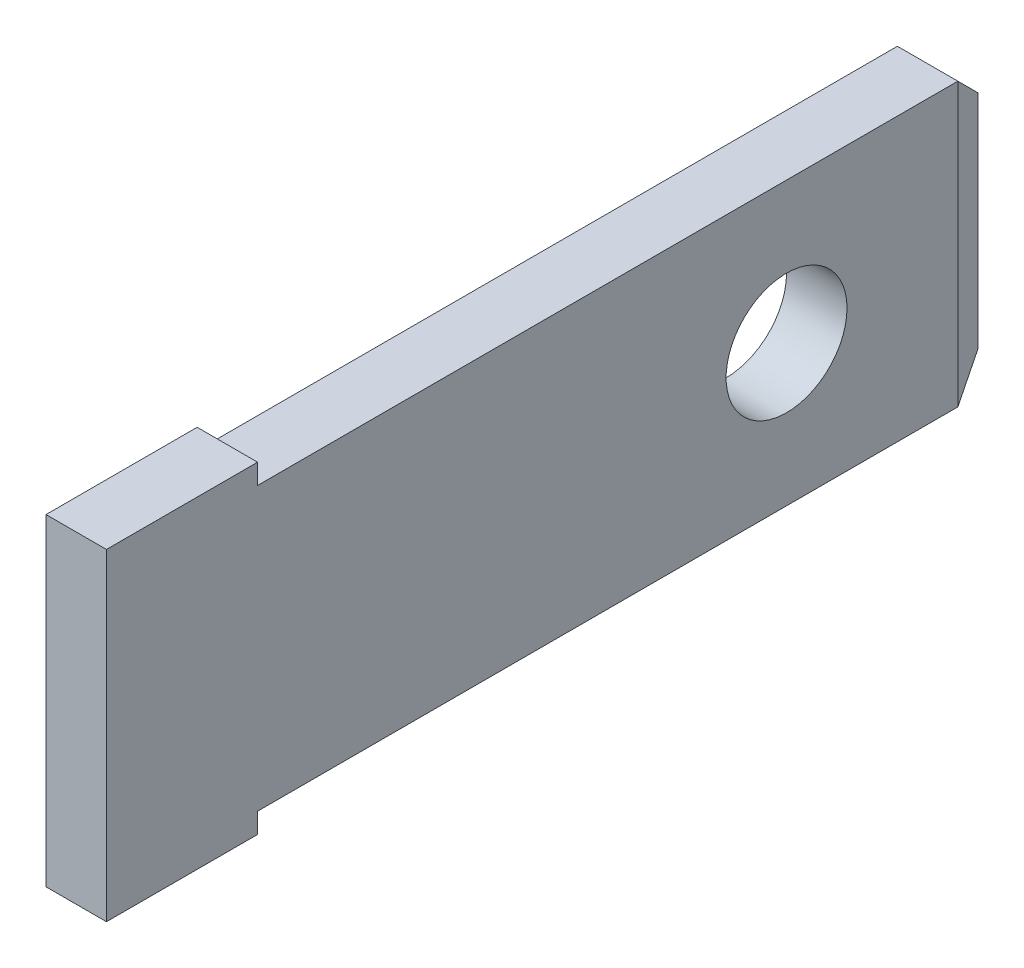
ISO-10303-21;
HEADER;
FILE_DESCRIPTION(('STEP AP214'),'2;1');
FILE_NAME('part.step','',(''),(''),'','','');
FILE_SCHEMA(('AUTOMOTIVE_DESIGN { 1 0 10303 214 1 1 1 1 }'));
ENDSEC;
DATA;
#1=APPLICATION_CONTEXT('core data for automotive mechanical design processes');
#2=APPLICATION_PROTOCOL_DEFINITION('international standard','automotive_design',2000,#1);
#3=PRODUCT_CONTEXT('',#1,'mechanical');
#4=PRODUCT('Part','Part','',(#3));
#5=PRODUCT_RELATED_PRODUCT_CATEGORY('part','',(#4));
#6=PRODUCT_DEFINITION_FORMATION('','',#4);
#7=PRODUCT_DEFINITION_CONTEXT('part definition',#1,'design');
#8=PRODUCT_DEFINITION('design','',#6,#7);
#9=PRODUCT_DEFINITION_SHAPE('','',#8);
#10=(LENGTH_UNIT() NAMED_UNIT(*) SI_UNIT(.MILLI.,.METRE.));
#11=(NAMED_UNIT(*) PLANE_ANGLE_UNIT() SI_UNIT($,.RADIAN.));
#12=(NAMED_UNIT(*) SI_UNIT($,.STERADIAN.) SOLID_ANGLE_UNIT());
#13=UNCERTAINTY_MEASURE_WITH_UNIT(LENGTH_MEASURE(1.E-05),#10,'distance_accuracy_value','');
#14=(GEOMETRIC_REPRESENTATION_CONTEXT(3) GLOBAL_UNCERTAINTY_ASSIGNED_CONTEXT((#13)) GLOBAL_UNIT_ASSIGNED_CONTEXT((#10,
#11,#12)) REPRESENTATION_CONTEXT('',''));
#15=CARTESIAN_POINT('',(0.,0.,0.));
#16=DIRECTION('',(0.,0.,1.));
#17=DIRECTION('',(1.,0.,0.));
#18=AXIS2_PLACEMENT_3D('',#15,#16,#17);
#19=CARTESIAN_POINT('',(0.25,1.35,-8.1));
#20=DIRECTION('',(0.948683298050514,0.,-0.316227766016836));
#21=DIRECTION('',(-0.316227766016836,0.,-0.948683298050514));
#22=AXIS2_PLACEMENT_3D('',#19,#20,#21);
#23=PLANE('',#22);
#24=DIRECTION('',(-0.229415733870561,-0.688247201611685,-0.688247201611686));
#25=VECTOR('',#24,1.);
#26=CARTESIAN_POINT('',(0.3,1.4,-7.95));
#27=LINE('',#26,#25);
#28=CARTESIAN_POINT('',(0.3,1.4,-7.95));
#29=VERTEX_POINT('',#28);
#30=CARTESIAN_POINT('',(0.2,1.1,-8.25));
#31=VERTEX_POINT('',#30);
#32=EDGE_CURVE('E108',#29,#31,#27,.T.);
#33=ORIENTED_EDGE('',*,*,#32,.F.);
#34=DIRECTION('',(0.,1.,0.));
#35=VECTOR('',#34,1.);
#36=CARTESIAN_POINT('',(0.299999999999999,1.6,-7.95));
#37=LINE('',#36,#35);
#38=CARTESIAN_POINT('',(0.3,-1.4,-7.95));
#39=VERTEX_POINT('',#38);
#40=EDGE_CURVE('E104',#39,#29,#37,.T.);
#41=ORIENTED_EDGE('',*,*,#40,.F.);
#42=DIRECTION('',(0.229415733870562,-0.688247201611685,0.688247201611686));
#43=VECTOR('',#42,1.);
#44=CARTESIAN_POINT('',(0.2,-1.1,-8.25));
#45=LINE('',#44,#43);
#46=CARTESIAN_POINT('',(0.2,-1.1,-8.25));
#47=VERTEX_POINT('',#46);
#48=EDGE_CURVE('E102',#47,#39,#45,.T.);
#49=ORIENTED_EDGE('',*,*,#48,.F.);
#50=DIRECTION('',(0.,1.,0.));
#51=VECTOR('',#50,1.);
#52=CARTESIAN_POINT('',(0.2,1.1,-8.25));
#53=LINE('',#52,#51);
#54=EDGE_CURVE('E90',#31,#47,#53,.F.);
#55=ORIENTED_EDGE('',*,*,#54,.F.);
#56=EDGE_LOOP('',(#33,#41,#49,#55));
#57=FACE_BOUND('',#56,.T.);
#58=ADVANCED_FACE('F16',(#57),#23,.T.);
#59=CARTESIAN_POINT('',(0.,1.1,-8.25));
#60=DIRECTION('',(0.,0.,-1.));
#61=DIRECTION('',(-1.,0.,0.));
#62=AXIS2_PLACEMENT_3D('',#59,#60,#61);
#63=PLANE('',#62);
#64=ORIENTED_EDGE('',*,*,#54,.T.);
#65=DIRECTION('',(1.,0.,0.));
#66=VECTOR('',#65,1.);
#67=CARTESIAN_POINT('',(0.,-1.1,-8.25));
#68=LINE('',#67,#66);
#69=CARTESIAN_POINT('',(-0.2,-1.1,-8.25));
#70=VERTEX_POINT('',#69);
#71=EDGE_CURVE('E96',#70,#47,#68,.T.);
#72=ORIENTED_EDGE('',*,*,#71,.F.);
#73=DIRECTION('',(0.,1.,0.));
#74=VECTOR('',#73,1.);
#75=CARTESIAN_POINT('',(-0.199999999999999,-0.250000000000002,-8.25));
#76=LINE('',#75,#74);
#77=CARTESIAN_POINT('',(-0.2,1.1,-8.25));
#78=VERTEX_POINT('',#77);
#79=EDGE_CURVE('E122',#78,#70,#76,.F.);
#80=ORIENTED_EDGE('',*,*,#79,.F.);
#81=DIRECTION('',(1.,0.,0.));
#82=VECTOR('',#81,1.);
#83=CARTESIAN_POINT('',(0.,1.1,-8.25));
#84=LINE('',#83,#82);
#85=EDGE_CURVE('E98',#31,#78,#84,.F.);
#86=ORIENTED_EDGE('',*,*,#85,.F.);
#87=EDGE_LOOP('',(#64,#72,#80,#86));
#88=FACE_BOUND('',#87,.T.);
#89=ADVANCED_FACE('F93',(#88),#63,.T.);
#90=CARTESIAN_POINT('',(0.,-1.1,-8.25));
#91=DIRECTION('',(0.,-0.707106781186548,-0.707106781186547));
#92=DIRECTION('',(0.,0.707106781186547,-0.707106781186548));
#93=AXIS2_PLACEMENT_3D('',#90,#91,#92);
#94=PLANE('',#93);
#95=ORIENTED_EDGE('',*,*,#48,.T.);
#96=DIRECTION('',(1.,0.,0.));
#97=VECTOR('',#96,1.);
#98=CARTESIAN_POINT('',(0.,-1.4,-7.95));
#99=LINE('',#98,#97);
#100=CARTESIAN_POINT('',(-0.3,-1.4,-7.95));
#101=VERTEX_POINT('',#100);
#102=EDGE_CURVE('E127',#101,#39,#99,.T.);
#103=ORIENTED_EDGE('',*,*,#102,.F.);
#104=DIRECTION('',(-0.229415733870563,-0.688247201611685,0.688247201611685));
#105=VECTOR('',#104,1.);
#106=CARTESIAN_POINT('',(-0.2,-1.1,-8.25));
#107=LINE('',#106,#105);
#108=EDGE_CURVE('E112',#70,#101,#107,.T.);
#109=ORIENTED_EDGE('',*,*,#108,.F.);
#110=ORIENTED_EDGE('',*,*,#71,.T.);
#111=EDGE_LOOP('',(#95,#103,#109,#110));
#112=FACE_BOUND('',#111,.T.);
#113=ADVANCED_FACE('F110',(#112),#94,.T.);
#114=CARTESIAN_POINT('',(0.,1.4,-7.95));
#115=DIRECTION('',(0.,0.707106781186548,-0.707106781186547));
#116=DIRECTION('',(0.,0.707106781186547,0.707106781186548));
#117=AXIS2_PLACEMENT_3D('',#114,#115,#116);
#118=PLANE('',#117);
#119=ORIENTED_EDGE('',*,*,#32,.T.);
#120=ORIENTED_EDGE('',*,*,#85,.T.);
#121=DIRECTION('',(0.229415733870564,-0.688247201611683,-0.688247201611687));
#122=VECTOR('',#121,1.);
#123=CARTESIAN_POINT('',(-0.300000000000001,1.4,-7.95));
#124=LINE('',#123,#122);
#125=CARTESIAN_POINT('',(-0.3,1.4,-7.95));
#126=VERTEX_POINT('',#125);
#127=EDGE_CURVE('E119',#126,#78,#124,.T.);
#128=ORIENTED_EDGE('',*,*,#127,.F.);
#129=DIRECTION('',(1.,0.,0.));
#130=VECTOR('',#129,1.);
#131=CARTESIAN_POINT('',(0.,1.4,-7.95));
#132=LINE('',#131,#130);
#133=EDGE_CURVE('E158',#29,#126,#132,.F.);
#134=ORIENTED_EDGE('',*,*,#133,.F.);
#135=EDGE_LOOP('',(#119,#120,#128,#134));
#136=FACE_BOUND('',#135,.T.);
#137=ADVANCED_FACE('F191',(#136),#118,.T.);
#138=CARTESIAN_POINT('',(0.299999999999999,1.6,0.));
#139=DIRECTION('',(1.,0.,0.));
#140=DIRECTION('',(0.,0.,-1.));
#141=AXIS2_PLACEMENT_3D('',#138,#139,#140);
#142=PLANE('',#141);
#143=CARTESIAN_POINT('',(0.3,0.,-6.25));
#144=DIRECTION('',(1.,0.,0.));
#145=DIRECTION('',(0.,0.,-1.));
#146=AXIS2_PLACEMENT_3D('',#143,#144,#145);
#147=CIRCLE('',#146,0.6);
#148=CARTESIAN_POINT('',(0.3,0.,-6.85));
#149=VERTEX_POINT('',#148);
#150=EDGE_CURVE('E19',#149,#149,#147,.F.);
#151=ORIENTED_EDGE('',*,*,#150,.T.);
#152=EDGE_LOOP('',(#151));
#153=FACE_BOUND('',#152,.T.);
#154=DIRECTION('',(0.,1.,0.));
#155=VECTOR('',#154,1.);
#156=CARTESIAN_POINT('',(0.3,1.6,-1.));
#157=LINE('',#156,#155);
#158=CARTESIAN_POINT('',(0.3,-1.4,-1.));
#159=VERTEX_POINT('',#158);
#160=CARTESIAN_POINT('',(0.3,-1.6,-1.));
#161=VERTEX_POINT('',#160);
#162=EDGE_CURVE('E132',#159,#161,#157,.F.);
#163=ORIENTED_EDGE('',*,*,#162,.F.);
#164=DIRECTION('',(0.,0.,-1.));
#165=VECTOR('',#164,1.);
#166=CARTESIAN_POINT('',(0.3,-1.4,-7.95));
#167=LINE('',#166,#165);
#168=EDGE_CURVE('E125',#39,#159,#167,.F.);
#169=ORIENTED_EDGE('',*,*,#168,.F.);
#170=ORIENTED_EDGE('',*,*,#40,.T.);
#171=DIRECTION('',(0.,0.,1.));
#172=VECTOR('',#171,1.);
#173=CARTESIAN_POINT('',(0.3,1.4,-1.));
#174=LINE('',#173,#172);
#175=CARTESIAN_POINT('',(0.299999999999999,1.4,-1.));
#176=VERTEX_POINT('',#175);
#177=EDGE_CURVE('E155',#176,#29,#174,.F.);
#178=ORIENTED_EDGE('',*,*,#177,.F.);
#179=DIRECTION('',(0.,1.,0.));
#180=VECTOR('',#179,1.);
#181=CARTESIAN_POINT('',(0.3,1.6,-1.));
#182=LINE('',#181,#180);
#183=CARTESIAN_POINT('',(0.299999999999999,1.6,-1.));
#184=VERTEX_POINT('',#183);
#185=EDGE_CURVE('E153',#184,#176,#182,.F.);
#186=ORIENTED_EDGE('',*,*,#185,.F.);
#187=DIRECTION('',(0.,0.,1.));
#188=VECTOR('',#187,1.);
#189=CARTESIAN_POINT('',(0.299999999999999,1.6,0.));
#190=LINE('',#189,#188);
#191=CARTESIAN_POINT('',(0.299999999999999,1.6,0.5));
#192=VERTEX_POINT('',#191);
#193=EDGE_CURVE('E148',#192,#184,#190,.F.);
#194=ORIENTED_EDGE('',*,*,#193,.F.);
#195=DIRECTION('',(0.,1.,0.));
#196=VECTOR('',#195,1.);
#197=CARTESIAN_POINT('',(0.3,0.,0.5));
#198=LINE('',#197,#196);
#199=CARTESIAN_POINT('',(0.299999999999999,-1.6,0.5));
#200=VERTEX_POINT('',#199);
#201=EDGE_CURVE('E140',#200,#192,#198,.T.);
#202=ORIENTED_EDGE('',*,*,#201,.F.);
#203=DIRECTION('',(0.,0.,-1.));
#204=VECTOR('',#203,1.);
#205=CARTESIAN_POINT('',(0.3,-1.6,0.));
#206=LINE('',#205,#204);
#207=EDGE_CURVE('E137',#161,#200,#206,.F.);
#208=ORIENTED_EDGE('',*,*,#207,.F.);
#209=EDGE_LOOP('',(#163,#169,#170,#178,#186,#194,#202,#208));
#210=FACE_BOUND('',#209,.T.);
#211=ADVANCED_FACE('F239',(#153,#210),#142,.T.);
#212=CARTESIAN_POINT('',(-0.25,-0.250000000000002,-8.1));
#213=DIRECTION('',(-0.948683298050513,0.,-0.31622776601684));
#214=DIRECTION('',(-0.31622776601684,0.,0.948683298050513));
#215=AXIS2_PLACEMENT_3D('',#212,#213,#214);
#216=PLANE('',#215);
#217=ORIENTED_EDGE('',*,*,#108,.T.);
#218=DIRECTION('',(0.,1.,0.));
#219=VECTOR('',#218,1.);
#220=CARTESIAN_POINT('',(-0.3,-1.6,-7.95));
#221=LINE('',#220,#219);
#222=EDGE_CURVE('E162',#126,#101,#221,.F.);
#223=ORIENTED_EDGE('',*,*,#222,.F.);
#224=ORIENTED_EDGE('',*,*,#127,.T.);
#225=ORIENTED_EDGE('',*,*,#79,.T.);
#226=EDGE_LOOP('',(#217,#223,#224,#225));
#227=FACE_BOUND('',#226,.T.);
#228=ADVANCED_FACE('F193',(#227),#216,.T.);
#229=CARTESIAN_POINT('',(0.,-1.4,-7.95));
#230=DIRECTION('',(0.,-1.,0.));
#231=DIRECTION('',(0.,0.,-1.));
#232=AXIS2_PLACEMENT_3D('',#229,#230,#231);
#233=PLANE('',#232);
#234=DIRECTION('',(0.,0.,1.));
#235=VECTOR('',#234,1.);
#236=CARTESIAN_POINT('',(-0.3,-1.4,0.));
#237=LINE('',#236,#235);
#238=CARTESIAN_POINT('',(-0.3,-1.4,-1.));
#239=VERTEX_POINT('',#238);
#240=EDGE_CURVE('E165',#101,#239,#237,.T.);
#241=ORIENTED_EDGE('',*,*,#240,.F.);
#242=ORIENTED_EDGE('',*,*,#102,.T.);
#243=ORIENTED_EDGE('',*,*,#168,.T.);
#244=DIRECTION('',(-1.,0.,0.));
#245=VECTOR('',#244,1.);
#246=CARTESIAN_POINT('',(0.,-1.4,-1.));
#247=LINE('',#246,#245);
#248=EDGE_CURVE('E129',#239,#159,#247,.F.);
#249=ORIENTED_EDGE('',*,*,#248,.F.);
#250=EDGE_LOOP('',(#241,#242,#243,#249));
#251=FACE_BOUND('',#250,.T.);
#252=ADVANCED_FACE('F196',(#251),#233,.T.);
#253=CARTESIAN_POINT('',(0.,1.6,-1.));
#254=DIRECTION('',(0.,0.,-1.));
#255=DIRECTION('',(-1.,0.,0.));
#256=AXIS2_PLACEMENT_3D('',#253,#254,#255);
#257=PLANE('',#256);
#258=DIRECTION('',(1.,0.,0.));
#259=VECTOR('',#258,1.);
#260=CARTESIAN_POINT('',(0.3,-1.6,-1.));
#261=LINE('',#260,#259);
#262=CARTESIAN_POINT('',(-0.3,-1.6,-1.));
#263=VERTEX_POINT('',#262);
#264=EDGE_CURVE('E134',#263,#161,#261,.T.);
#265=ORIENTED_EDGE('',*,*,#264,.F.);
#266=DIRECTION('',(0.,1.,0.));
#267=VECTOR('',#266,1.);
#268=CARTESIAN_POINT('',(-0.3,-1.6,-1.));
#269=LINE('',#268,#267);
#270=EDGE_CURVE('E168',#239,#263,#269,.F.);
#271=ORIENTED_EDGE('',*,*,#270,.F.);
#272=ORIENTED_EDGE('',*,*,#248,.T.);
#273=ORIENTED_EDGE('',*,*,#162,.T.);
#274=EDGE_LOOP('',(#265,#271,#272,#273));
#275=FACE_BOUND('',#274,.T.);
#276=ADVANCED_FACE('F200',(#275),#257,.T.);
#277=CARTESIAN_POINT('',(0.3,-1.6,0.));
#278=DIRECTION('',(0.,-1.,0.));
#279=DIRECTION('',(0.,0.,-1.));
#280=AXIS2_PLACEMENT_3D('',#277,#278,#279);
#281=PLANE('',#280);
#282=ORIENTED_EDGE('',*,*,#264,.T.);
#283=ORIENTED_EDGE('',*,*,#207,.T.);
#284=DIRECTION('',(1.,0.,0.));
#285=VECTOR('',#284,1.);
#286=CARTESIAN_POINT('',(0.,-1.6,0.5));
#287=LINE('',#286,#285);
#288=CARTESIAN_POINT('',(-0.3,-1.6,0.5));
#289=VERTEX_POINT('',#288);
#290=EDGE_CURVE('E142',#289,#200,#287,.T.);
#291=ORIENTED_EDGE('',*,*,#290,.F.);
#292=DIRECTION('',(0.,0.,1.));
#293=VECTOR('',#292,1.);
#294=CARTESIAN_POINT('',(-0.3,-1.6,0.));
#295=LINE('',#294,#293);
#296=EDGE_CURVE('E171',#263,#289,#295,.T.);
#297=ORIENTED_EDGE('',*,*,#296,.F.);
#298=EDGE_LOOP('',(#282,#283,#291,#297));
#299=FACE_BOUND('',#298,.T.);
#300=ADVANCED_FACE('F204',(#299),#281,.T.);
#301=CARTESIAN_POINT('',(0.,0.,0.5));
#302=DIRECTION('',(0.,0.,1.));
#303=DIRECTION('',(1.,0.,0.));
#304=AXIS2_PLACEMENT_3D('',#301,#302,#303);
#305=PLANE('',#304);
#306=DIRECTION('',(0.,1.,0.));
#307=VECTOR('',#306,1.);
#308=CARTESIAN_POINT('',(-0.3,-1.6,0.5));
#309=LINE('',#308,#307);
#310=CARTESIAN_POINT('',(-0.3,1.6,0.5));
#311=VERTEX_POINT('',#310);
#312=EDGE_CURVE('E174',#289,#311,#309,.T.);
#313=ORIENTED_EDGE('',*,*,#312,.F.);
#314=ORIENTED_EDGE('',*,*,#290,.T.);
#315=ORIENTED_EDGE('',*,*,#201,.T.);
#316=DIRECTION('',(1.,0.,0.));
#317=VECTOR('',#316,1.);
#318=CARTESIAN_POINT('',(-0.300000000000001,1.6,0.5));
#319=LINE('',#318,#317);
#320=EDGE_CURVE('E145',#311,#192,#319,.T.);
#321=ORIENTED_EDGE('',*,*,#320,.F.);
#322=EDGE_LOOP('',(#313,#314,#315,#321));
#323=FACE_BOUND('',#322,.T.);
#324=ADVANCED_FACE('F207',(#323),#305,.T.);
#325=CARTESIAN_POINT('',(-0.300000000000001,1.6,0.));
#326=DIRECTION('',(0.,1.,0.));
#327=DIRECTION('',(0.,0.,1.));
#328=AXIS2_PLACEMENT_3D('',#325,#326,#327);
#329=PLANE('',#328);
#330=DIRECTION('',(-1.,0.,0.));
#331=VECTOR('',#330,1.);
#332=CARTESIAN_POINT('',(0.,1.6,-1.));
#333=LINE('',#332,#331);
#334=CARTESIAN_POINT('',(-0.3,1.6,-1.));
#335=VERTEX_POINT('',#334);
#336=EDGE_CURVE('E150',#335,#184,#333,.F.);
#337=ORIENTED_EDGE('',*,*,#336,.F.);
#338=DIRECTION('',(0.,0.,1.));
#339=VECTOR('',#338,1.);
#340=CARTESIAN_POINT('',(-0.3,1.6,0.));
#341=LINE('',#340,#339);
#342=EDGE_CURVE('E177',#311,#335,#341,.F.);
#343=ORIENTED_EDGE('',*,*,#342,.F.);
#344=ORIENTED_EDGE('',*,*,#320,.T.);
#345=ORIENTED_EDGE('',*,*,#193,.T.);
#346=EDGE_LOOP('',(#337,#343,#344,#345));
#347=FACE_BOUND('',#346,.T.);
#348=ADVANCED_FACE('F210',(#347),#329,.T.);
#349=CARTESIAN_POINT('',(0.,1.6,-1.));
#350=DIRECTION('',(0.,0.,-1.));
#351=DIRECTION('',(-1.,0.,0.));
#352=AXIS2_PLACEMENT_3D('',#349,#350,#351);
#353=PLANE('',#352);
#354=ORIENTED_EDGE('',*,*,#336,.T.);
#355=ORIENTED_EDGE('',*,*,#185,.T.);
#356=DIRECTION('',(1.,0.,0.));
#357=VECTOR('',#356,1.);
#358=CARTESIAN_POINT('',(0.,1.4,-1.));
#359=LINE('',#358,#357);
#360=CARTESIAN_POINT('',(-0.3,1.4,-1.));
#361=VERTEX_POINT('',#360);
#362=EDGE_CURVE('E33',#361,#176,#359,.T.);
#363=ORIENTED_EDGE('',*,*,#362,.F.);
#364=DIRECTION('',(0.,1.,0.));
#365=VECTOR('',#364,1.);
#366=CARTESIAN_POINT('',(-0.3,-1.6,-1.));
#367=LINE('',#366,#365);
#368=EDGE_CURVE('E180',#335,#361,#367,.F.);
#369=ORIENTED_EDGE('',*,*,#368,.F.);
#370=EDGE_LOOP('',(#354,#355,#363,#369));
#371=FACE_BOUND('',#370,.T.);
#372=ADVANCED_FACE('F213',(#371),#353,.T.);
#373=CARTESIAN_POINT('',(0.,1.4,-1.));
#374=DIRECTION('',(0.,1.,0.));
#375=DIRECTION('',(0.,0.,1.));
#376=AXIS2_PLACEMENT_3D('',#373,#374,#375);
#377=PLANE('',#376);
#378=DIRECTION('',(0.,0.,1.));
#379=VECTOR('',#378,1.);
#380=CARTESIAN_POINT('',(-0.3,1.4,0.));
#381=LINE('',#380,#379);
#382=EDGE_CURVE('E25',#361,#126,#381,.F.);
#383=ORIENTED_EDGE('',*,*,#382,.F.);
#384=ORIENTED_EDGE('',*,*,#362,.T.);
#385=ORIENTED_EDGE('',*,*,#177,.T.);
#386=ORIENTED_EDGE('',*,*,#133,.T.);
#387=EDGE_LOOP('',(#383,#384,#385,#386));
#388=FACE_BOUND('',#387,.T.);
#389=ADVANCED_FACE('F188',(#388),#377,.T.);
#390=CARTESIAN_POINT('',(0.,0.,-6.25));
#391=DIRECTION('',(1.,0.,0.));
#392=DIRECTION('',(0.,0.,-1.));
#393=AXIS2_PLACEMENT_3D('',#390,#391,#392);
#394=CYLINDRICAL_SURFACE('',#393,0.6);
#395=ORIENTED_EDGE('',*,*,#150,.F.);
#396=EDGE_LOOP('',(#395));
#397=FACE_BOUND('',#396,.T.);
#398=CARTESIAN_POINT('',(-0.3,0.,-6.25));
#399=DIRECTION('',(1.,0.,0.));
#400=DIRECTION('',(0.,0.,-1.));
#401=AXIS2_PLACEMENT_3D('',#398,#399,#400);
#402=CIRCLE('',#401,0.6);
#403=CARTESIAN_POINT('',(-0.3,0.,-6.85));
#404=VERTEX_POINT('',#403);
#405=EDGE_CURVE('E11',#404,#404,#402,.T.);
#406=ORIENTED_EDGE('',*,*,#405,.F.);
#407=EDGE_LOOP('',(#406));
#408=FACE_BOUND('',#407,.T.);
#409=ADVANCED_FACE('F221',(#397,#408),#394,.F.);
#410=CARTESIAN_POINT('',(-0.3,-1.6,0.));
#411=DIRECTION('',(-1.,0.,0.));
#412=DIRECTION('',(0.,0.,1.));
#413=AXIS2_PLACEMENT_3D('',#410,#411,#412);
#414=PLANE('',#413);
#415=ORIENTED_EDGE('',*,*,#405,.T.);
#416=EDGE_LOOP('',(#415));
#417=FACE_BOUND('',#416,.T.);
#418=ORIENTED_EDGE('',*,*,#368,.T.);
#419=ORIENTED_EDGE('',*,*,#382,.T.);
#420=ORIENTED_EDGE('',*,*,#222,.T.);
#421=ORIENTED_EDGE('',*,*,#240,.T.);
#422=ORIENTED_EDGE('',*,*,#270,.T.);
#423=ORIENTED_EDGE('',*,*,#296,.T.);
#424=ORIENTED_EDGE('',*,*,#312,.T.);
#425=ORIENTED_EDGE('',*,*,#342,.T.);
#426=EDGE_LOOP('',(#418,#419,#420,#421,#422,#423,#424,#425));
#427=FACE_BOUND('',#426,.T.);
#428=ADVANCED_FACE('F185',(#417,#427),#414,.T.);
#429=CLOSED_SHELL('',(#58,#89,#113,#137,#211,#228,#252,#276,#300,#324,#348,#372,#389,#409,#428));
#430=MANIFOLD_SOLID_BREP('B1',#429);
#431=ADVANCED_BREP_SHAPE_REPRESENTATION('',(#18,#430),#14);
#432=SHAPE_DEFINITION_REPRESENTATION(#9,#431);
ENDSEC;
END-ISO-10303-21;
